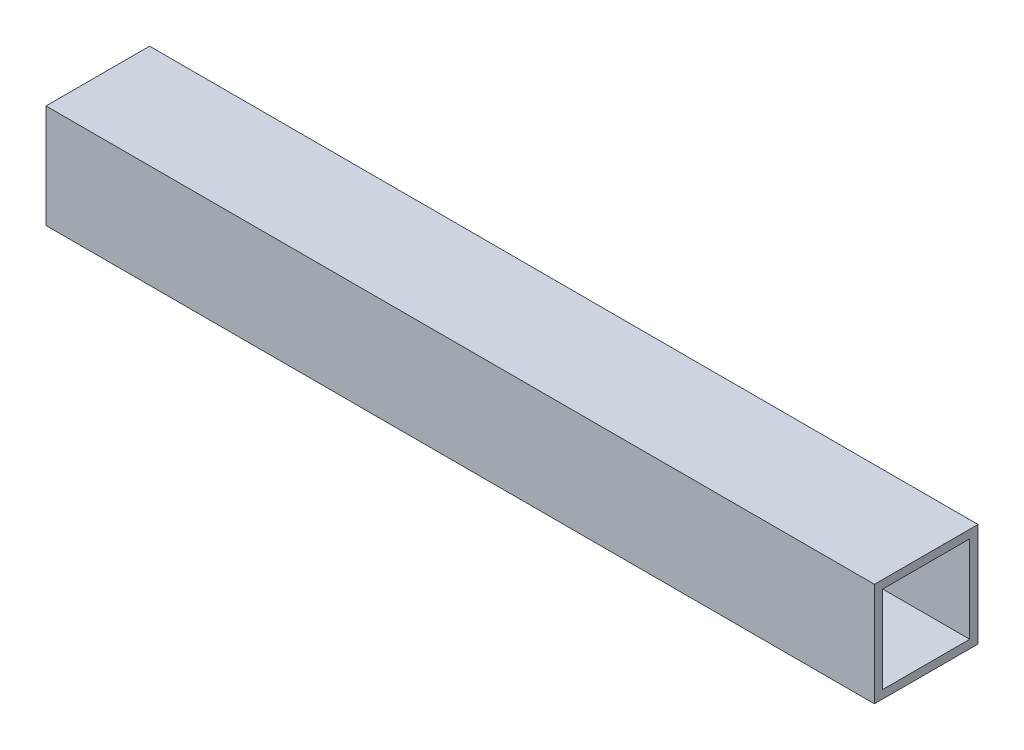
ISO-10303-21;
HEADER;
FILE_DESCRIPTION(('STEP AP214'),'2;1');
FILE_NAME('part.step','',(''),(''),'','','');
FILE_SCHEMA(('AUTOMOTIVE_DESIGN { 1 0 10303 214 1 1 1 1 }'));
ENDSEC;
DATA;
#1=APPLICATION_CONTEXT('core data for automotive mechanical design processes');
#2=APPLICATION_PROTOCOL_DEFINITION('international standard','automotive_design',2000,#1);
#3=PRODUCT_CONTEXT('',#1,'mechanical');
#4=PRODUCT('Part','Part','',(#3));
#5=PRODUCT_RELATED_PRODUCT_CATEGORY('part','',(#4));
#6=PRODUCT_DEFINITION_FORMATION('','',#4);
#7=PRODUCT_DEFINITION_CONTEXT('part definition',#1,'design');
#8=PRODUCT_DEFINITION('design','',#6,#7);
#9=PRODUCT_DEFINITION_SHAPE('','',#8);
#10=(LENGTH_UNIT() NAMED_UNIT(*) SI_UNIT(.MILLI.,.METRE.));
#11=(NAMED_UNIT(*) PLANE_ANGLE_UNIT() SI_UNIT($,.RADIAN.));
#12=(NAMED_UNIT(*) SI_UNIT($,.STERADIAN.) SOLID_ANGLE_UNIT());
#13=UNCERTAINTY_MEASURE_WITH_UNIT(LENGTH_MEASURE(1.E-05),#10,'distance_accuracy_value','');
#14=(GEOMETRIC_REPRESENTATION_CONTEXT(3) GLOBAL_UNCERTAINTY_ASSIGNED_CONTEXT((#13)) GLOBAL_UNIT_ASSIGNED_CONTEXT((#10,
#11,#12)) REPRESENTATION_CONTEXT('',''));
#15=CARTESIAN_POINT('',(0.,0.,0.));
#16=DIRECTION('',(0.,0.,1.));
#17=DIRECTION('',(1.,0.,0.));
#18=AXIS2_PLACEMENT_3D('',#15,#16,#17);
#19=CARTESIAN_POINT('',(304.8,0.,0.));
#20=DIRECTION('',(-1.,0.,0.));
#21=DIRECTION('',(0.,0.,1.));
#22=AXIS2_PLACEMENT_3D('',#19,#20,#21);
#23=PLANE('',#22);
#24=DIRECTION('',(0.,0.,-1.));
#25=VECTOR('',#24,1.);
#26=CARTESIAN_POINT('',(304.8,-160.250909090909,-28.6327272727273));
#27=LINE('',#26,#25);
#28=CARTESIAN_POINT('',(304.8,-160.250909090909,9.46727272727271));
#29=VERTEX_POINT('',#28);
#30=CARTESIAN_POINT('',(304.8,-160.250909090909,-28.6327272727273));
#31=VERTEX_POINT('',#30);
#32=EDGE_CURVE('E159',#29,#31,#27,.T.);
#33=ORIENTED_EDGE('',*,*,#32,.T.);
#34=DIRECTION('',(0.,1.,0.));
#35=VECTOR('',#34,1.);
#36=CARTESIAN_POINT('',(304.8,-160.250909090909,-28.6327272727273));
#37=LINE('',#36,#35);
#38=CARTESIAN_POINT('',(304.8,-122.150909090909,-28.6327272727273));
#39=VERTEX_POINT('',#38);
#40=EDGE_CURVE('E163',#31,#39,#37,.T.);
#41=ORIENTED_EDGE('',*,*,#40,.T.);
#42=DIRECTION('',(0.,0.,1.));
#43=VECTOR('',#42,1.);
#44=CARTESIAN_POINT('',(304.8,-122.150909090909,-28.6327272727273));
#45=LINE('',#44,#43);
#46=CARTESIAN_POINT('',(304.8,-122.150909090909,9.46727272727271));
#47=VERTEX_POINT('',#46);
#48=EDGE_CURVE('E167',#39,#47,#45,.T.);
#49=ORIENTED_EDGE('',*,*,#48,.T.);
#50=DIRECTION('',(0.,-1.,0.));
#51=VECTOR('',#50,1.);
#52=CARTESIAN_POINT('',(304.8,-160.250909090909,9.46727272727271));
#53=LINE('',#52,#51);
#54=EDGE_CURVE('E170',#47,#29,#53,.T.);
#55=ORIENTED_EDGE('',*,*,#54,.T.);
#56=EDGE_LOOP('',(#33,#41,#49,#55));
#57=FACE_BOUND('',#56,.T.);
#58=DIRECTION('',(0.,0.,-1.));
#59=VECTOR('',#58,1.);
#60=CARTESIAN_POINT('',(304.8,-157.202909090909,6.41927272727273));
#61=LINE('',#60,#59);
#62=CARTESIAN_POINT('',(304.8,-157.202909090909,6.41927272727273));
#63=VERTEX_POINT('',#62);
#64=CARTESIAN_POINT('',(304.8,-157.202909090909,-25.5847272727273));
#65=VERTEX_POINT('',#64);
#66=EDGE_CURVE('E111',#63,#65,#61,.T.);
#67=ORIENTED_EDGE('',*,*,#66,.F.);
#68=DIRECTION('',(0.,-1.,0.));
#69=VECTOR('',#68,1.);
#70=CARTESIAN_POINT('',(304.8,-157.202909090909,6.41927272727273));
#71=LINE('',#70,#69);
#72=CARTESIAN_POINT('',(304.8,-125.198909090909,6.41927272727273));
#73=VERTEX_POINT('',#72);
#74=EDGE_CURVE('E137',#73,#63,#71,.T.);
#75=ORIENTED_EDGE('',*,*,#74,.F.);
#76=DIRECTION('',(0.,0.,1.));
#77=VECTOR('',#76,1.);
#78=CARTESIAN_POINT('',(304.8,-125.198909090909,6.41927272727273));
#79=LINE('',#78,#77);
#80=CARTESIAN_POINT('',(304.8,-125.198909090909,-25.5847272727273));
#81=VERTEX_POINT('',#80);
#82=EDGE_CURVE('E133',#81,#73,#79,.T.);
#83=ORIENTED_EDGE('',*,*,#82,.F.);
#84=DIRECTION('',(0.,1.,0.));
#85=VECTOR('',#84,1.);
#86=CARTESIAN_POINT('',(304.8,-157.202909090909,-25.5847272727273));
#87=LINE('',#86,#85);
#88=EDGE_CURVE('E120',#65,#81,#87,.T.);
#89=ORIENTED_EDGE('',*,*,#88,.F.);
#90=EDGE_LOOP('',(#67,#75,#83,#89));
#91=FACE_BOUND('',#90,.T.);
#92=ADVANCED_FACE('F45',(#57,#91),#23,.F.);
#93=CARTESIAN_POINT('',(0.,0.,0.));
#94=DIRECTION('',(-1.,0.,0.));
#95=DIRECTION('',(0.,0.,1.));
#96=AXIS2_PLACEMENT_3D('',#93,#94,#95);
#97=PLANE('',#96);
#98=DIRECTION('',(0.,0.,-1.));
#99=VECTOR('',#98,1.);
#100=CARTESIAN_POINT('',(0.,-160.250909090909,-28.6327272727273));
#101=LINE('',#100,#99);
#102=CARTESIAN_POINT('',(0.,-160.250909090909,9.46727272727271));
#103=VERTEX_POINT('',#102);
#104=CARTESIAN_POINT('',(0.,-160.250909090909,-28.6327272727273));
#105=VERTEX_POINT('',#104);
#106=EDGE_CURVE('E129',#103,#105,#101,.T.);
#107=ORIENTED_EDGE('',*,*,#106,.F.);
#108=DIRECTION('',(0.,-1.,0.));
#109=VECTOR('',#108,1.);
#110=CARTESIAN_POINT('',(0.,-160.250909090909,9.46727272727271));
#111=LINE('',#110,#109);
#112=CARTESIAN_POINT('',(0.,-122.150909090909,9.46727272727271));
#113=VERTEX_POINT('',#112);
#114=EDGE_CURVE('E164',#113,#103,#111,.T.);
#115=ORIENTED_EDGE('',*,*,#114,.F.);
#116=DIRECTION('',(0.,0.,1.));
#117=VECTOR('',#116,1.);
#118=CARTESIAN_POINT('',(0.,-122.150909090909,-28.6327272727273));
#119=LINE('',#118,#117);
#120=CARTESIAN_POINT('',(0.,-122.150909090909,-28.6327272727273));
#121=VERTEX_POINT('',#120);
#122=EDGE_CURVE('E180',#121,#113,#119,.T.);
#123=ORIENTED_EDGE('',*,*,#122,.F.);
#124=DIRECTION('',(0.,1.,0.));
#125=VECTOR('',#124,1.);
#126=CARTESIAN_POINT('',(0.,-160.250909090909,-28.6327272727273));
#127=LINE('',#126,#125);
#128=EDGE_CURVE('E177',#105,#121,#127,.T.);
#129=ORIENTED_EDGE('',*,*,#128,.F.);
#130=EDGE_LOOP('',(#107,#115,#123,#129));
#131=FACE_BOUND('',#130,.T.);
#132=DIRECTION('',(0.,-1.,0.));
#133=VECTOR('',#132,1.);
#134=CARTESIAN_POINT('',(0.,-157.202909090909,6.41927272727273));
#135=LINE('',#134,#133);
#136=CARTESIAN_POINT('',(0.,-125.198909090909,6.41927272727273));
#137=VERTEX_POINT('',#136);
#138=CARTESIAN_POINT('',(0.,-157.202909090909,6.41927272727273));
#139=VERTEX_POINT('',#138);
#140=EDGE_CURVE('E121',#137,#139,#135,.T.);
#141=ORIENTED_EDGE('',*,*,#140,.T.);
#142=DIRECTION('',(0.,0.,-1.));
#143=VECTOR('',#142,1.);
#144=CARTESIAN_POINT('',(0.,-157.202909090909,6.41927272727273));
#145=LINE('',#144,#143);
#146=CARTESIAN_POINT('',(0.,-157.202909090909,-25.5847272727273));
#147=VERTEX_POINT('',#146);
#148=EDGE_CURVE('E69',#139,#147,#145,.T.);
#149=ORIENTED_EDGE('',*,*,#148,.T.);
#150=DIRECTION('',(0.,1.,0.));
#151=VECTOR('',#150,1.);
#152=CARTESIAN_POINT('',(0.,-157.202909090909,-25.5847272727273));
#153=LINE('',#152,#151);
#154=CARTESIAN_POINT('',(0.,-125.198909090909,-25.5847272727273));
#155=VERTEX_POINT('',#154);
#156=EDGE_CURVE('E127',#147,#155,#153,.T.);
#157=ORIENTED_EDGE('',*,*,#156,.T.);
#158=DIRECTION('',(0.,0.,1.));
#159=VECTOR('',#158,1.);
#160=CARTESIAN_POINT('',(0.,-125.198909090909,6.41927272727273));
#161=LINE('',#160,#159);
#162=EDGE_CURVE('E146',#155,#137,#161,.T.);
#163=ORIENTED_EDGE('',*,*,#162,.T.);
#164=EDGE_LOOP('',(#141,#149,#157,#163));
#165=FACE_BOUND('',#164,.T.);
#166=ADVANCED_FACE('F203',(#131,#165),#97,.T.);
#167=CARTESIAN_POINT('',(304.8,-160.250909090909,-28.6327272727273));
#168=DIRECTION('',(0.,1.,0.));
#169=DIRECTION('',(0.,0.,1.));
#170=AXIS2_PLACEMENT_3D('',#167,#168,#169);
#171=PLANE('',#170);
#172=ORIENTED_EDGE('',*,*,#106,.T.);
#173=DIRECTION('',(-1.,0.,0.));
#174=VECTOR('',#173,1.);
#175=CARTESIAN_POINT('',(304.8,-160.250909090909,-28.6327272727273));
#176=LINE('',#175,#174);
#177=EDGE_CURVE('E11',#31,#105,#176,.T.);
#178=ORIENTED_EDGE('',*,*,#177,.F.);
#179=ORIENTED_EDGE('',*,*,#32,.F.);
#180=DIRECTION('',(-1.,0.,0.));
#181=VECTOR('',#180,1.);
#182=CARTESIAN_POINT('',(304.8,-160.250909090909,9.46727272727271));
#183=LINE('',#182,#181);
#184=EDGE_CURVE('E173',#29,#103,#183,.T.);
#185=ORIENTED_EDGE('',*,*,#184,.T.);
#186=EDGE_LOOP('',(#172,#178,#179,#185));
#187=FACE_BOUND('',#186,.T.);
#188=ADVANCED_FACE('F47',(#187),#171,.F.);
#189=CARTESIAN_POINT('',(304.8,-160.250909090909,-28.6327272727273));
#190=DIRECTION('',(0.,0.,1.));
#191=DIRECTION('',(1.,0.,0.));
#192=AXIS2_PLACEMENT_3D('',#189,#190,#191);
#193=PLANE('',#192);
#194=ORIENTED_EDGE('',*,*,#128,.T.);
#195=DIRECTION('',(-1.,0.,0.));
#196=VECTOR('',#195,1.);
#197=CARTESIAN_POINT('',(304.8,-122.150909090909,-28.6327272727273));
#198=LINE('',#197,#196);
#199=EDGE_CURVE('E54',#39,#121,#198,.T.);
#200=ORIENTED_EDGE('',*,*,#199,.F.);
#201=ORIENTED_EDGE('',*,*,#40,.F.);
#202=ORIENTED_EDGE('',*,*,#177,.T.);
#203=EDGE_LOOP('',(#194,#200,#201,#202));
#204=FACE_BOUND('',#203,.T.);
#205=ADVANCED_FACE('F213',(#204),#193,.F.);
#206=CARTESIAN_POINT('',(304.8,-122.150909090909,-28.6327272727273));
#207=DIRECTION('',(0.,-1.,0.));
#208=DIRECTION('',(0.,0.,-1.));
#209=AXIS2_PLACEMENT_3D('',#206,#207,#208);
#210=PLANE('',#209);
#211=ORIENTED_EDGE('',*,*,#122,.T.);
#212=DIRECTION('',(-1.,0.,0.));
#213=VECTOR('',#212,1.);
#214=CARTESIAN_POINT('',(304.8,-122.150909090909,9.46727272727271));
#215=LINE('',#214,#213);
#216=EDGE_CURVE('E188',#47,#113,#215,.T.);
#217=ORIENTED_EDGE('',*,*,#216,.F.);
#218=ORIENTED_EDGE('',*,*,#48,.F.);
#219=ORIENTED_EDGE('',*,*,#199,.T.);
#220=EDGE_LOOP('',(#211,#217,#218,#219));
#221=FACE_BOUND('',#220,.T.);
#222=ADVANCED_FACE('F197',(#221),#210,.F.);
#223=CARTESIAN_POINT('',(304.8,-160.250909090909,9.46727272727271));
#224=DIRECTION('',(0.,0.,-1.));
#225=DIRECTION('',(-1.,0.,0.));
#226=AXIS2_PLACEMENT_3D('',#223,#224,#225);
#227=PLANE('',#226);
#228=ORIENTED_EDGE('',*,*,#114,.T.);
#229=ORIENTED_EDGE('',*,*,#184,.F.);
#230=ORIENTED_EDGE('',*,*,#54,.F.);
#231=ORIENTED_EDGE('',*,*,#216,.T.);
#232=EDGE_LOOP('',(#228,#229,#230,#231));
#233=FACE_BOUND('',#232,.T.);
#234=ADVANCED_FACE('F207',(#233),#227,.F.);
#235=CARTESIAN_POINT('',(304.8,-157.202909090909,6.41927272727273));
#236=DIRECTION('',(0.,1.,0.));
#237=DIRECTION('',(0.,0.,1.));
#238=AXIS2_PLACEMENT_3D('',#235,#236,#237);
#239=PLANE('',#238);
#240=ORIENTED_EDGE('',*,*,#148,.F.);
#241=DIRECTION('',(-1.,0.,0.));
#242=VECTOR('',#241,1.);
#243=CARTESIAN_POINT('',(304.8,-157.202909090909,6.41927272727273));
#244=LINE('',#243,#242);
#245=EDGE_CURVE('E115',#63,#139,#244,.T.);
#246=ORIENTED_EDGE('',*,*,#245,.F.);
#247=ORIENTED_EDGE('',*,*,#66,.T.);
#248=DIRECTION('',(-1.,0.,0.));
#249=VECTOR('',#248,1.);
#250=CARTESIAN_POINT('',(304.8,-157.202909090909,-25.5847272727273));
#251=LINE('',#250,#249);
#252=EDGE_CURVE('E114',#65,#147,#251,.T.);
#253=ORIENTED_EDGE('',*,*,#252,.T.);
#254=EDGE_LOOP('',(#240,#246,#247,#253));
#255=FACE_BOUND('',#254,.T.);
#256=ADVANCED_FACE('F113',(#255),#239,.T.);
#257=CARTESIAN_POINT('',(304.8,-157.202909090909,-25.5847272727273));
#258=DIRECTION('',(0.,0.,1.));
#259=DIRECTION('',(1.,0.,0.));
#260=AXIS2_PLACEMENT_3D('',#257,#258,#259);
#261=PLANE('',#260);
#262=ORIENTED_EDGE('',*,*,#156,.F.);
#263=ORIENTED_EDGE('',*,*,#252,.F.);
#264=ORIENTED_EDGE('',*,*,#88,.T.);
#265=DIRECTION('',(-1.,0.,0.));
#266=VECTOR('',#265,1.);
#267=CARTESIAN_POINT('',(304.8,-125.198909090909,-25.5847272727273));
#268=LINE('',#267,#266);
#269=EDGE_CURVE('E130',#81,#155,#268,.T.);
#270=ORIENTED_EDGE('',*,*,#269,.T.);
#271=EDGE_LOOP('',(#262,#263,#264,#270));
#272=FACE_BOUND('',#271,.T.);
#273=ADVANCED_FACE('F124',(#272),#261,.T.);
#274=CARTESIAN_POINT('',(304.8,-125.198909090909,6.41927272727273));
#275=DIRECTION('',(0.,-1.,0.));
#276=DIRECTION('',(0.,0.,-1.));
#277=AXIS2_PLACEMENT_3D('',#274,#275,#276);
#278=PLANE('',#277);
#279=ORIENTED_EDGE('',*,*,#162,.F.);
#280=ORIENTED_EDGE('',*,*,#269,.F.);
#281=ORIENTED_EDGE('',*,*,#82,.T.);
#282=DIRECTION('',(-1.,0.,0.));
#283=VECTOR('',#282,1.);
#284=CARTESIAN_POINT('',(304.8,-125.198909090909,6.41927272727273));
#285=LINE('',#284,#283);
#286=EDGE_CURVE('E61',#73,#137,#285,.T.);
#287=ORIENTED_EDGE('',*,*,#286,.T.);
#288=EDGE_LOOP('',(#279,#280,#281,#287));
#289=FACE_BOUND('',#288,.T.);
#290=ADVANCED_FACE('F236',(#289),#278,.T.);
#291=CARTESIAN_POINT('',(304.8,-157.202909090909,6.41927272727273));
#292=DIRECTION('',(0.,0.,-1.));
#293=DIRECTION('',(-1.,0.,0.));
#294=AXIS2_PLACEMENT_3D('',#291,#292,#293);
#295=PLANE('',#294);
#296=ORIENTED_EDGE('',*,*,#140,.F.);
#297=ORIENTED_EDGE('',*,*,#286,.F.);
#298=ORIENTED_EDGE('',*,*,#74,.T.);
#299=ORIENTED_EDGE('',*,*,#245,.T.);
#300=EDGE_LOOP('',(#296,#297,#298,#299));
#301=FACE_BOUND('',#300,.T.);
#302=ADVANCED_FACE('F240',(#301),#295,.T.);
#303=CLOSED_SHELL('',(#92,#166,#188,#205,#222,#234,#256,#273,#290,#302));
#304=MANIFOLD_SOLID_BREP('B2',#303);
#305=ADVANCED_BREP_SHAPE_REPRESENTATION('',(#18,#304),#14);
#306=SHAPE_DEFINITION_REPRESENTATION(#9,#305);
ENDSEC;
END-ISO-10303-21;
